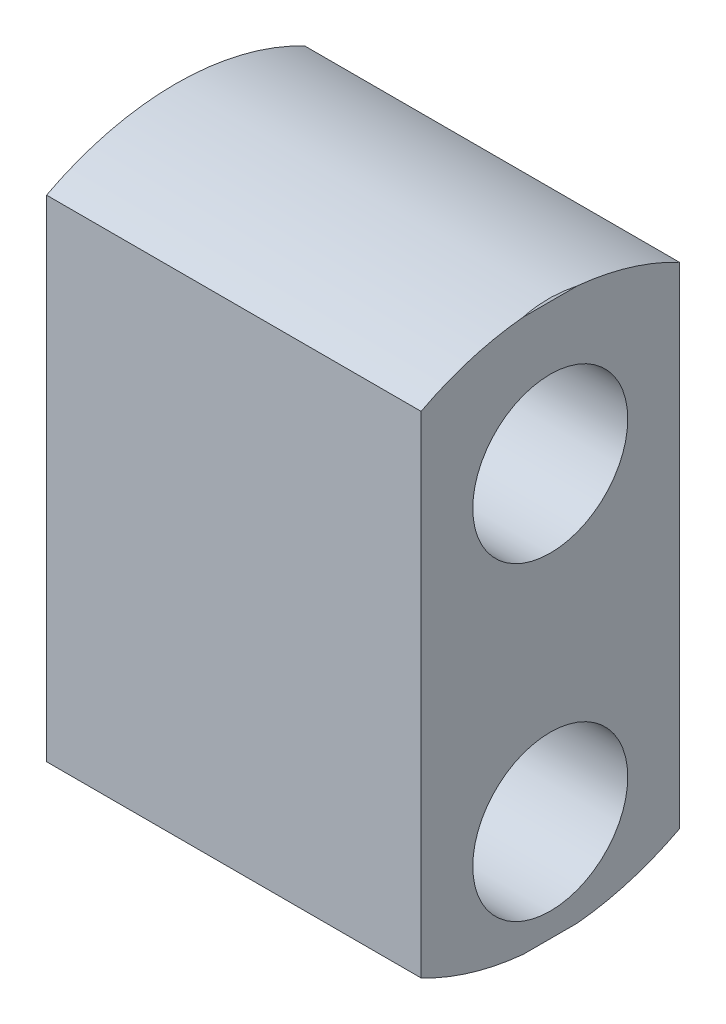
ISO-10303-21;
HEADER;
FILE_DESCRIPTION(('STEP AP214'),'2;1');
FILE_NAME('part.step','',(''),(''),'','','');
FILE_SCHEMA(('AUTOMOTIVE_DESIGN { 1 0 10303 214 1 1 1 1 }'));
ENDSEC;
DATA;
#1=APPLICATION_CONTEXT('core data for automotive mechanical design processes');
#2=APPLICATION_PROTOCOL_DEFINITION('international standard','automotive_design',2000,#1);
#3=PRODUCT_CONTEXT('',#1,'mechanical');
#4=PRODUCT('Part','Part','',(#3));
#5=PRODUCT_RELATED_PRODUCT_CATEGORY('part','',(#4));
#6=PRODUCT_DEFINITION_FORMATION('','',#4);
#7=PRODUCT_DEFINITION_CONTEXT('part definition',#1,'design');
#8=PRODUCT_DEFINITION('design','',#6,#7);
#9=PRODUCT_DEFINITION_SHAPE('','',#8);
#10=(LENGTH_UNIT() NAMED_UNIT(*) SI_UNIT(.MILLI.,.METRE.));
#11=(NAMED_UNIT(*) PLANE_ANGLE_UNIT() SI_UNIT($,.RADIAN.));
#12=(NAMED_UNIT(*) SI_UNIT($,.STERADIAN.) SOLID_ANGLE_UNIT());
#13=UNCERTAINTY_MEASURE_WITH_UNIT(LENGTH_MEASURE(1.E-05),#10,'distance_accuracy_value','');
#14=(GEOMETRIC_REPRESENTATION_CONTEXT(3) GLOBAL_UNCERTAINTY_ASSIGNED_CONTEXT((#13)) GLOBAL_UNIT_ASSIGNED_CONTEXT((#10,
#11,#12)) REPRESENTATION_CONTEXT('',''));
#15=CARTESIAN_POINT('',(0.,0.,0.));
#16=DIRECTION('',(0.,0.,1.));
#17=DIRECTION('',(1.,0.,0.));
#18=AXIS2_PLACEMENT_3D('',#15,#16,#17);
#19=CARTESIAN_POINT('',(0.,0.,5.));
#20=DIRECTION('',(0.,0.,1.));
#21=DIRECTION('',(1.,0.,0.));
#22=AXIS2_PLACEMENT_3D('',#19,#20,#21);
#23=PLANE('',#22);
#24=DIRECTION('',(0.,1.,0.));
#25=VECTOR('',#24,1.);
#26=CARTESIAN_POINT('',(-22.1518796505501,-14.001699548298,5.));
#27=LINE('',#26,#25);
#28=CARTESIAN_POINT('',(-22.1518796505501,-11.3508428851222,5.));
#29=VERTEX_POINT('',#28);
#30=CARTESIAN_POINT('',(-22.1518796505501,7.64737350525238,5.));
#31=VERTEX_POINT('',#30);
#32=EDGE_CURVE('E138',#29,#31,#27,.T.);
#33=ORIENTED_EDGE('',*,*,#32,.F.);
#34=DIRECTION('',(1.,0.,0.));
#35=VECTOR('',#34,1.);
#36=CARTESIAN_POINT('',(-22.1518796505501,-11.3508428851222,5.));
#37=LINE('',#36,#35);
#38=CARTESIAN_POINT('',(-7.65187965055005,-11.3508428851222,5.));
#39=VERTEX_POINT('',#38);
#40=EDGE_CURVE('E205',#29,#39,#37,.T.);
#41=ORIENTED_EDGE('',*,*,#40,.T.);
#42=DIRECTION('',(0.,1.,0.));
#43=VECTOR('',#42,1.);
#44=CARTESIAN_POINT('',(-7.65187965055005,-14.001699548298,5.));
#45=LINE('',#44,#43);
#46=CARTESIAN_POINT('',(-7.65187965055005,7.64737350525238,5.));
#47=VERTEX_POINT('',#46);
#48=EDGE_CURVE('E143',#39,#47,#45,.T.);
#49=ORIENTED_EDGE('',*,*,#48,.T.);
#50=DIRECTION('',(1.,0.,0.));
#51=VECTOR('',#50,1.);
#52=CARTESIAN_POINT('',(-22.1518796505501,7.64737350525238,5.));
#53=LINE('',#52,#51);
#54=EDGE_CURVE('E203',#47,#31,#53,.F.);
#55=ORIENTED_EDGE('',*,*,#54,.T.);
#56=EDGE_LOOP('',(#33,#41,#49,#55));
#57=FACE_BOUND('',#56,.T.);
#58=ADVANCED_FACE('F61',(#57),#23,.T.);
#59=CARTESIAN_POINT('',(0.,0.,-5.));
#60=DIRECTION('',(0.,0.,1.));
#61=DIRECTION('',(1.,0.,0.));
#62=AXIS2_PLACEMENT_3D('',#59,#60,#61);
#63=PLANE('',#62);
#64=CARTESIAN_POINT('',(-14.9018796505501,-4.00169954829801,-5.));
#65=DIRECTION('',(0.,0.,1.));
#66=DIRECTION('',(1.,0.,0.));
#67=AXIS2_PLACEMENT_3D('',#64,#65,#66);
#68=CIRCLE('',#67,4.);
#69=CARTESIAN_POINT('',(-10.9018796505501,-4.00169954829801,-5.));
#70=VERTEX_POINT('',#69);
#71=EDGE_CURVE('E148',#70,#70,#68,.T.);
#72=ORIENTED_EDGE('',*,*,#71,.T.);
#73=EDGE_LOOP('',(#72));
#74=FACE_BOUND('',#73,.T.);
#75=DIRECTION('',(1.,0.,0.));
#76=VECTOR('',#75,1.);
#77=CARTESIAN_POINT('',(-22.1518796505501,-11.3508428851222,-5.));
#78=LINE('',#77,#76);
#79=CARTESIAN_POINT('',(-22.1518796505501,-11.3508428851222,-5.));
#80=VERTEX_POINT('',#79);
#81=CARTESIAN_POINT('',(-7.65187965055005,-11.3508428851222,-5.));
#82=VERTEX_POINT('',#81);
#83=EDGE_CURVE('E128',#80,#82,#78,.T.);
#84=ORIENTED_EDGE('',*,*,#83,.F.);
#85=DIRECTION('',(0.,1.,0.));
#86=VECTOR('',#85,1.);
#87=CARTESIAN_POINT('',(-22.1518796505501,-14.001699548298,-5.));
#88=LINE('',#87,#86);
#89=CARTESIAN_POINT('',(-22.1518796505501,7.64737350525238,-5.));
#90=VERTEX_POINT('',#89);
#91=EDGE_CURVE('E136',#80,#90,#88,.T.);
#92=ORIENTED_EDGE('',*,*,#91,.T.);
#93=DIRECTION('',(1.,0.,0.));
#94=VECTOR('',#93,1.);
#95=CARTESIAN_POINT('',(-22.1518796505501,7.64737350525238,-5.));
#96=LINE('',#95,#94);
#97=CARTESIAN_POINT('',(-7.65187965055005,7.64737350525238,-5.));
#98=VERTEX_POINT('',#97);
#99=EDGE_CURVE('E117',#98,#90,#96,.F.);
#100=ORIENTED_EDGE('',*,*,#99,.F.);
#101=DIRECTION('',(0.,1.,0.));
#102=VECTOR('',#101,1.);
#103=CARTESIAN_POINT('',(-7.65187965055005,-14.001699548298,-5.));
#104=LINE('',#103,#102);
#105=EDGE_CURVE('E144',#82,#98,#104,.T.);
#106=ORIENTED_EDGE('',*,*,#105,.F.);
#107=EDGE_LOOP('',(#84,#92,#100,#106));
#108=FACE_BOUND('',#107,.T.);
#109=ADVANCED_FACE('F142',(#74,#108),#63,.F.);
#110=CARTESIAN_POINT('',(-7.65187965055005,-14.001699548298,5.));
#111=DIRECTION('',(-1.,0.,0.));
#112=DIRECTION('',(0.,0.,1.));
#113=AXIS2_PLACEMENT_3D('',#110,#111,#112);
#114=PLANE('',#113);
#115=CARTESIAN_POINT('',(-7.65187965055004,3.39277613170199,0.));
#116=DIRECTION('',(-1.,0.,0.));
#117=DIRECTION('',(0.,-1.,0.));
#118=AXIS2_PLACEMENT_3D('',#115,#116,#117);
#119=CIRCLE('',#118,3.);
#120=CARTESIAN_POINT('',(-7.65187965055004,0.392776131701986,0.));
#121=VERTEX_POINT('',#120);
#122=EDGE_CURVE('E218',#121,#121,#119,.T.);
#123=ORIENTED_EDGE('',*,*,#122,.T.);
#124=EDGE_LOOP('',(#123));
#125=FACE_BOUND('',#124,.T.);
#126=CARTESIAN_POINT('',(-7.65187965055004,-8.60893162829801,0.));
#127=DIRECTION('',(-1.,0.,0.));
#128=DIRECTION('',(0.,-1.,0.));
#129=AXIS2_PLACEMENT_3D('',#126,#127,#128);
#130=CIRCLE('',#129,3.);
#131=CARTESIAN_POINT('',(-7.65187965055004,-11.608931628298,0.));
#132=VERTEX_POINT('',#131);
#133=EDGE_CURVE('E162',#132,#132,#130,.T.);
#134=ORIENTED_EDGE('',*,*,#133,.T.);
#135=EDGE_LOOP('',(#134));
#136=FACE_BOUND('',#135,.T.);
#137=CARTESIAN_POINT('',(-7.65187965055005,-1.85173468993494,0.));
#138=DIRECTION('',(1.,0.,0.));
#139=DIRECTION('',(0.,0.,-1.));
#140=AXIS2_PLACEMENT_3D('',#137,#138,#139);
#141=CIRCLE('',#140,10.734666110498);
#142=CARTESIAN_POINT('',(-7.65187965055005,8.83120000125134,1.05259816061186));
#143=VERTEX_POINT('',#142);
#144=EDGE_CURVE('E82',#143,#47,#141,.T.);
#145=ORIENTED_EDGE('',*,*,#144,.T.);
#146=ORIENTED_EDGE('',*,*,#48,.F.);
#147=CARTESIAN_POINT('',(-7.65187965055005,-12.5346693811212,1.05259816061185));
#148=VERTEX_POINT('',#147);
#149=EDGE_CURVE('E269',#39,#148,#141,.T.);
#150=ORIENTED_EDGE('',*,*,#149,.T.);
#151=DIRECTION('',(0.,0.,-1.));
#152=VECTOR('',#151,1.);
#153=CARTESIAN_POINT('',(-7.65187965055005,-12.5346693811212,5.));
#154=LINE('',#153,#152);
#155=CARTESIAN_POINT('',(-7.65187965055005,-12.5346693811212,-1.05259816061186));
#156=VERTEX_POINT('',#155);
#157=EDGE_CURVE('E208',#156,#148,#154,.F.);
#158=ORIENTED_EDGE('',*,*,#157,.F.);
#159=EDGE_CURVE('E90',#156,#82,#141,.T.);
#160=ORIENTED_EDGE('',*,*,#159,.T.);
#161=ORIENTED_EDGE('',*,*,#105,.T.);
#162=CARTESIAN_POINT('',(-7.65187965055005,8.83120000125134,-1.05259816061186));
#163=VERTEX_POINT('',#162);
#164=EDGE_CURVE('E123',#98,#163,#141,.T.);
#165=ORIENTED_EDGE('',*,*,#164,.T.);
#166=DIRECTION('',(0.,0.,-1.));
#167=VECTOR('',#166,1.);
#168=CARTESIAN_POINT('',(-7.65187965055005,8.83120000125134,5.));
#169=LINE('',#168,#167);
#170=EDGE_CURVE('E211',#143,#163,#169,.T.);
#171=ORIENTED_EDGE('',*,*,#170,.F.);
#172=EDGE_LOOP('',(#145,#146,#150,#158,#160,#161,#165,#171));
#173=FACE_BOUND('',#172,.T.);
#174=ADVANCED_FACE('F63',(#125,#136,#173),#114,.F.);
#175=CARTESIAN_POINT('',(-22.1518796505501,-14.001699548298,5.));
#176=DIRECTION('',(-1.,0.,0.));
#177=DIRECTION('',(0.,-1.,0.));
#178=AXIS2_PLACEMENT_3D('',#175,#176,#177);
#179=PLANE('',#178);
#180=CARTESIAN_POINT('',(-22.1518796505501,3.39277613170198,0.));
#181=DIRECTION('',(-1.,0.,0.));
#182=DIRECTION('',(0.,-1.,0.));
#183=AXIS2_PLACEMENT_3D('',#180,#181,#182);
#184=CIRCLE('',#183,3.);
#185=CARTESIAN_POINT('',(-22.1518796505501,0.392776131701982,0.));
#186=VERTEX_POINT('',#185);
#187=EDGE_CURVE('E217',#186,#186,#184,.T.);
#188=ORIENTED_EDGE('',*,*,#187,.F.);
#189=EDGE_LOOP('',(#188));
#190=FACE_BOUND('',#189,.T.);
#191=CARTESIAN_POINT('',(-22.1518796505501,-8.60893162829801,0.));
#192=DIRECTION('',(-1.,0.,0.));
#193=DIRECTION('',(0.,-1.,0.));
#194=AXIS2_PLACEMENT_3D('',#191,#192,#193);
#195=CIRCLE('',#194,3.);
#196=CARTESIAN_POINT('',(-22.1518796505501,-11.608931628298,0.));
#197=VERTEX_POINT('',#196);
#198=EDGE_CURVE('E221',#197,#197,#195,.T.);
#199=ORIENTED_EDGE('',*,*,#198,.F.);
#200=EDGE_LOOP('',(#199));
#201=FACE_BOUND('',#200,.T.);
#202=ORIENTED_EDGE('',*,*,#32,.T.);
#203=CARTESIAN_POINT('',(-22.1518796505501,-1.85173468993494,0.));
#204=DIRECTION('',(1.,0.,0.));
#205=DIRECTION('',(0.,0.,-1.));
#206=AXIS2_PLACEMENT_3D('',#203,#204,#205);
#207=CIRCLE('',#206,10.734666110498);
#208=EDGE_CURVE('E120',#90,#31,#207,.T.);
#209=ORIENTED_EDGE('',*,*,#208,.F.);
#210=ORIENTED_EDGE('',*,*,#91,.F.);
#211=EDGE_CURVE('E139',#29,#80,#207,.T.);
#212=ORIENTED_EDGE('',*,*,#211,.F.);
#213=EDGE_LOOP('',(#202,#209,#210,#212));
#214=FACE_BOUND('',#213,.T.);
#215=ADVANCED_FACE('F134',(#190,#201,#214),#179,.T.);
#216=CARTESIAN_POINT('',(-15.1707717198946,-1.85173468993494,5.));
#217=DIRECTION('',(0.,0.,-1.));
#218=DIRECTION('',(-1.,0.,0.));
#219=AXIS2_PLACEMENT_3D('',#216,#217,#218);
#220=CYLINDRICAL_SURFACE('',#219,13.0636454164449);
#221=ORIENTED_EDGE('',*,*,#170,.T.);
#222=CARTESIAN_POINT('',(-7.65187965055005,8.83120000125134,-1.05259816061186));
#223=CARTESIAN_POINT('',(-7.67637752821421,8.84841187683,-0.878236899272604));
#224=CARTESIAN_POINT('',(-7.69493425842149,8.86137647549456,-0.7025871070402));
#225=CARTESIAN_POINT('',(-7.71966237630475,8.87860496264287,-0.351285343478452));
#226=CARTESIAN_POINT('',(-7.72592282534147,8.88293142056309,-0.175642671739214));
#227=CARTESIAN_POINT('',(-7.72592282534149,8.88293142056309,0.17564267173927));
#228=CARTESIAN_POINT('',(-7.71966237630478,8.87860496264287,0.351285343478517));
#229=CARTESIAN_POINT('',(-7.69493425842144,8.86137647549456,0.70258710704027));
#230=CARTESIAN_POINT('',(-7.67637752821406,8.84841187683,0.878236899272671));
#231=CARTESIAN_POINT('',(-7.65187965054969,8.83120000125135,1.05259816061191));
#232=B_SPLINE_CURVE_WITH_KNOTS('',3,(#222,#223,#224,#225,#226,#227,#228,#229,#230,#231),
.UNSPECIFIED.,.F.,.F.,(4,2,2,2,4),(0.,0.530639223236817,1.05742066876958,1.58420211430236,
2.11484133753919),.UNSPECIFIED.);
#233=EDGE_CURVE('E129',#163,#143,#232,.T.);
#234=ORIENTED_EDGE('',*,*,#233,.T.);
#235=EDGE_LOOP('',(#221,#234));
#236=FACE_BOUND('',#235,.T.);
#237=ADVANCED_FACE('F188',(#236),#220,.T.);
#238=ORIENTED_EDGE('',*,*,#157,.T.);
#239=CARTESIAN_POINT('',(-7.65187965055005,-12.5346693811212,1.05259816061185));
#240=CARTESIAN_POINT('',(-7.67637752821421,-12.5518812566999,0.878236899272588));
#241=CARTESIAN_POINT('',(-7.69493425842149,-12.5648458553644,0.702587107040187));
#242=CARTESIAN_POINT('',(-7.71966237630475,-12.5820743425127,0.351285343478445));
#243=CARTESIAN_POINT('',(-7.72592282534147,-12.586400800433,0.175642671739211));
#244=CARTESIAN_POINT('',(-7.72592282534149,-12.586400800433,-0.175642671739267));
#245=CARTESIAN_POINT('',(-7.71966237630478,-12.5820743425127,-0.35128534347851));
#246=CARTESIAN_POINT('',(-7.69493425842144,-12.5648458553644,-0.702587107040258));
#247=CARTESIAN_POINT('',(-7.67637752821407,-12.5518812566999,-0.878236899272655));
#248=CARTESIAN_POINT('',(-7.6518796505497,-12.5346693811212,-1.0525981606119));
#249=B_SPLINE_CURVE_WITH_KNOTS('',3,(#239,#240,#241,#242,#243,#244,#245,#246,#247,#248),
.UNSPECIFIED.,.F.,.F.,(4,2,2,2,4),(0.,0.530639223236807,1.05742066876956,1.58420211430233,
2.11484133753915),.UNSPECIFIED.);
#250=EDGE_CURVE('E13',#148,#156,#249,.T.);
#251=ORIENTED_EDGE('',*,*,#250,.T.);
#252=EDGE_LOOP('',(#238,#251));
#253=FACE_BOUND('',#252,.T.);
#254=ADVANCED_FACE('F191',(#253),#220,.T.);
#255=CARTESIAN_POINT('',(-14.9018796505501,-4.00169954829801,5.));
#256=DIRECTION('',(0.,0.,-1.));
#257=DIRECTION('',(-1.,0.,0.));
#258=AXIS2_PLACEMENT_3D('',#255,#256,#257);
#259=CYLINDRICAL_SURFACE('',#258,4.);
#260=ORIENTED_EDGE('',*,*,#71,.F.);
#261=EDGE_LOOP('',(#260));
#262=FACE_BOUND('',#261,.T.);
#263=CARTESIAN_POINT('',(-14.9018796505501,-8.00169954829801,2.93790217689747));
#264=CARTESIAN_POINT('',(-15.009680971212,-8.00170256781092,2.93789671743648));
#265=CARTESIAN_POINT('',(-15.1174486315377,-7.99734124209962,2.93700984025039));
#266=CARTESIAN_POINT('',(-15.332282009062,-7.97993526927935,2.93333465818504));
#267=CARTESIAN_POINT('',(-15.4393476269973,-7.96688941988753,2.93054609003495));
#268=CARTESIAN_POINT('',(-15.6521142106599,-7.93219344685846,2.92272806018889));
#269=CARTESIAN_POINT('',(-15.7578135114334,-7.91053369082764,2.91769608907048));
#270=CARTESIAN_POINT('',(-15.9669588269825,-7.85879799050505,2.90482538152114));
#271=CARTESIAN_POINT('',(-16.0704049419854,-7.82872242139683,2.89698677020809));
#272=CARTESIAN_POINT('',(-16.2747489162819,-7.76027579226539,2.87768193864195));
#273=CARTESIAN_POINT('',(-16.3756316948074,-7.72186455834107,2.8661980211918));
#274=CARTESIAN_POINT('',(-16.5734605314913,-7.63727248829404,2.8386364966831));
#275=CARTESIAN_POINT('',(-16.6704061666831,-7.59109082012143,2.82255839755556));
#276=CARTESIAN_POINT('',(-16.8592389264312,-7.49169915035806,2.78471028546148));
#277=CARTESIAN_POINT('',(-16.9511356482307,-7.43850318647467,2.76295155807114));
#278=CARTESIAN_POINT('',(-17.1290393239133,-7.32598080818305,2.71253291442309));
#279=CARTESIAN_POINT('',(-17.215048886495,-7.26665713868815,2.68387608059279));
#280=CARTESIAN_POINT('',(-17.4157412847546,-7.11652930842585,2.60436630595782));
#281=CARTESIAN_POINT('',(-17.5268847951609,-7.02314268521054,2.5492658452967));
#282=CARTESIAN_POINT('',(-17.7323810857431,-6.83153387913876,2.41953435559964));
#283=CARTESIAN_POINT('',(-17.8267488687989,-6.73331611827405,2.34492092652089));
#284=CARTESIAN_POINT('',(-17.9546163009476,-6.58724913505948,2.21743892015415));
#285=CARTESIAN_POINT('',(-17.9950493221483,-6.53863946985574,2.1722067035936));
#286=CARTESIAN_POINT('',(-18.0712285712394,-6.44279748265441,2.07663927848713));
#287=CARTESIAN_POINT('',(-18.10697662525,-6.39556462961459,2.02630607186742));
#288=CARTESIAN_POINT('',(-18.1738401704307,-6.30333510242198,1.92071415436311));
#289=CARTESIAN_POINT('',(-18.2049538191641,-6.25833932234235,1.8654534984234));
#290=CARTESIAN_POINT('',(-18.2626860209339,-6.17142353735232,1.75035824851849));
#291=CARTESIAN_POINT('',(-18.2893047552279,-6.12950340845481,1.69052383913139));
#292=CARTESIAN_POINT('',(-18.3365390757819,-6.05231325624153,1.57111108356259));
#293=CARTESIAN_POINT('',(-18.3574468123908,-6.01678235978814,1.51181659721875));
#294=CARTESIAN_POINT('',(-18.3958170453833,-5.94949276512536,1.39004868266576));
#295=CARTESIAN_POINT('',(-18.4132783506615,-5.91773537256338,1.32757416477099));
#296=CARTESIAN_POINT('',(-18.4608472970604,-5.82880172949509,1.1360557128877));
#297=CARTESIAN_POINT('',(-18.4861811265437,-5.77789363379996,1.00280907533354));
#298=CARTESIAN_POINT('',(-18.526399875771,-5.69435133085046,0.725740654940914));
#299=CARTESIAN_POINT('',(-18.5410204671694,-5.66218317689288,0.581742191618851));
#300=CARTESIAN_POINT('',(-18.5602697474315,-5.61933162437254,0.289903961710105));
#301=CARTESIAN_POINT('',(-18.5648963333352,-5.60865274766199,0.142063393281493));
#302=CARTESIAN_POINT('',(-18.564644912228,-5.60923226055088,-0.159140819206892));
#303=CARTESIAN_POINT('',(-18.5594031596428,-5.62133020097263,-0.312503215182147));
#304=CARTESIAN_POINT('',(-18.5380849086173,-5.66863559505376,-0.614875723977807));
#305=CARTESIAN_POINT('',(-18.5220074544655,-5.70384508715046,-0.763885451682174));
#306=CARTESIAN_POINT('',(-18.4773141899336,-5.79582095299882,-1.053315854851));
#307=CARTESIAN_POINT('',(-18.4486860862252,-5.85260845506874,-1.1937279548948));
#308=CARTESIAN_POINT('',(-18.3765530499302,-5.98469478254403,-1.46137541606051));
#309=CARTESIAN_POINT('',(-18.3330557427232,-6.05998411409623,-1.5886174876851));
#310=CARTESIAN_POINT('',(-18.2308939715834,-6.22124645162448,-1.82161510367655));
#311=CARTESIAN_POINT('',(-18.1728596968045,-6.30671272027255,-1.9279976223801));
#312=CARTESIAN_POINT('',(-18.0398209907047,-6.48476810967602,-2.12257500500665));
#313=CARTESIAN_POINT('',(-17.9648209043153,-6.57735540274264,-2.21077451455));
#314=CARTESIAN_POINT('',(-17.8001349460509,-6.76122363957894,-2.36646926403887));
#315=CARTESIAN_POINT('',(-17.7108398028002,-6.85248344567824,-2.43440615130473));
#316=CARTESIAN_POINT('',(-17.5178343196894,-7.03056693226742,-2.5534814864412));
#317=CARTESIAN_POINT('',(-17.4141180800086,-7.117388777158,-2.60461303012508));
#318=CARTESIAN_POINT('',(-17.1853336037448,-7.2892490431576,-2.69605446813942));
#319=CARTESIAN_POINT('',(-17.059206271523,-7.37353585925649,-2.7351074104965));
#320=CARTESIAN_POINT('',(-16.7955702440908,-7.52836014291613,-2.79989897674929));
#321=CARTESIAN_POINT('',(-16.658054591674,-7.59888911611821,-2.82562939117325));
#322=CARTESIAN_POINT('',(-16.4327381153113,-7.69830111418814,-2.85871451744375));
#323=CARTESIAN_POINT('',(-16.3476412881867,-7.73241057393771,-2.86927924615723));
#324=CARTESIAN_POINT('',(-16.1750394860819,-7.79478184956928,-2.88759769654569));
#325=CARTESIAN_POINT('',(-16.0875348966445,-7.82304459555299,-2.89535186547549));
#326=CARTESIAN_POINT('',(-15.9105681052247,-7.87352392163788,-2.90858320705104));
#327=CARTESIAN_POINT('',(-15.8211045208626,-7.89573607313026,-2.914058713415));
#328=CARTESIAN_POINT('',(-15.6407926827676,-7.93393791619768,-2.92314357523141));
#329=CARTESIAN_POINT('',(-15.5499447860541,-7.94992918485265,-2.92675340373538));
#330=CARTESIAN_POINT('',(-15.3539851000055,-7.97747175026114,-2.93282947929561));
#331=CARTESIAN_POINT('',(-15.248725614939,-7.98803519097404,-2.93505211786091));
#332=CARTESIAN_POINT('',(-15.0376725254679,-8.0007918685541,-2.9377215050738));
#333=CARTESIAN_POINT('',(-14.9318788712434,-8.00298430969315,-2.93816808489345));
#334=CARTESIAN_POINT('',(-14.7203864476874,-7.99898025685951,-2.93733958474523));
#335=CARTESIAN_POINT('',(-14.6146877856964,-7.99277827428577,-2.9360633783541));
#336=CARTESIAN_POINT('',(-14.4041543731407,-7.97202177187799,-2.93163059719315));
#337=CARTESIAN_POINT('',(-14.2993196153363,-7.95746732211292,-2.92847403819763));
#338=CARTESIAN_POINT('',(-14.0870715086722,-7.91937352773688,-2.91974445783367));
#339=CARTESIAN_POINT('',(-13.9797216836546,-7.8954995179528,-2.91408022785082));
#340=CARTESIAN_POINT('',(-13.7675253967852,-7.83905456907667,-2.89967878911494));
#341=CARTESIAN_POINT('',(-13.6626792120821,-7.80648267196085,-2.89094124181951));
#342=CARTESIAN_POINT('',(-13.4564543862391,-7.73301520621397,-2.86953527130995));
#343=CARTESIAN_POINT('',(-13.3550728012059,-7.6921269203846,-2.85687028236602));
#344=CARTESIAN_POINT('',(-13.1566168797544,-7.60251882012134,-2.82654720969687));
#345=CARTESIAN_POINT('',(-13.059541262973,-7.55380135385474,-2.80889062187552));
#346=CARTESIAN_POINT('',(-12.8926341911276,-7.46143964777074,-2.77220500648114));
#347=CARTESIAN_POINT('',(-12.8217146595811,-7.41924803723559,-2.75444879555444));
#348=CARTESIAN_POINT('',(-12.6834571783057,-7.33116119891118,-2.71470750677571));
#349=CARTESIAN_POINT('',(-12.6161184371111,-7.28526679524692,-2.69272336842807));
#350=CARTESIAN_POINT('',(-12.4855387782905,-7.19039898159534,-2.64397532890143));
#351=CARTESIAN_POINT('',(-12.4222946109618,-7.1414280756749,-2.61721528315047));
#352=CARTESIAN_POINT('',(-12.3003032970381,-7.04111326699932,-2.55838331797283));
#353=CARTESIAN_POINT('',(-12.2415562136401,-6.98976933091251,-2.52631132391794));
#354=CARTESIAN_POINT('',(-12.128535013477,-6.88519272757367,-2.4561591266616));
#355=CARTESIAN_POINT('',(-12.0742995314484,-6.83194841744838,-2.4180338355897));
#356=CARTESIAN_POINT('',(-11.9711602831235,-6.72500692932499,-2.33567558727321));
#357=CARTESIAN_POINT('',(-11.922256539916,-6.67130974936686,-2.29144260358143));
#358=CARTESIAN_POINT('',(-11.8300139146579,-6.56463010099413,-2.19679602515773));
#359=CARTESIAN_POINT('',(-11.7866729447925,-6.51164737115394,-2.14638476322029));
#360=CARTESIAN_POINT('',(-11.7055998986951,-6.40755671525802,-2.03948782684823));
#361=CARTESIAN_POINT('',(-11.6678671566039,-6.35644856717866,-1.98300287491137));
#362=CARTESIAN_POINT('',(-11.6023938398735,-6.26360076064418,-1.87189069400491));
#363=CARTESIAN_POINT('',(-11.573992450709,-6.2214996343242,-1.81795228814607));
#364=CARTESIAN_POINT('',(-11.5212110227573,-6.14025680303012,-1.70599813158619));
#365=CARTESIAN_POINT('',(-11.4968323374378,-6.10111609650005,-1.64798101789915));
#366=CARTESIAN_POINT('',(-11.4519001274539,-6.02643225461246,-1.52828946255565));
#367=CARTESIAN_POINT('',(-11.4313455259335,-5.9908881077594,-1.4666160569755));
#368=CARTESIAN_POINT('',(-11.3937963577036,-5.92389168359821,-1.34003778167696));
#369=CARTESIAN_POINT('',(-11.3768031577505,-5.89244097897575,-1.27513168313376));
#370=CARTESIAN_POINT('',(-11.3313761042125,-5.80606077277836,-1.0788897038214));
#371=CARTESIAN_POINT('',(-11.3076012943329,-5.75754373953914,-0.943546901253224));
#372=CARTESIAN_POINT('',(-11.2708567594739,-5.68024349698937,-0.666024848336979));
#373=CARTESIAN_POINT('',(-11.2578884804453,-5.65146292857676,-0.523844685817844));
#374=CARTESIAN_POINT('',(-11.241129273725,-5.6139528511755,-0.230082378356814));
#375=CARTESIAN_POINT('',(-11.2377557838466,-5.60613619973332,-0.0783585208082983));
#376=CARTESIAN_POINT('',(-11.2409927977351,-5.61350572939934,0.224443812335953));
#377=CARTESIAN_POINT('',(-11.247605467984,-5.6286969020213,0.375522140753779));
#378=CARTESIAN_POINT('',(-11.2717842473497,-5.68196087982656,0.675634736282255));
#379=CARTESIAN_POINT('',(-11.2895514955559,-5.72045338766389,0.824578936520633));
#380=CARTESIAN_POINT('',(-11.3380473190853,-5.81886435988126,1.11297645983188));
#381=CARTESIAN_POINT('',(-11.3687726122038,-5.87877739796879,1.25243217590711));
#382=CARTESIAN_POINT('',(-11.4447236669882,-6.01515220967478,1.51446905624154));
#383=CARTESIAN_POINT('',(-11.4896030790152,-6.09120580977913,1.63736231132472));
#384=CARTESIAN_POINT('',(-11.5960869476295,-6.25587205932742,1.8662714772892));
#385=CARTESIAN_POINT('',(-11.657682491807,-6.34447800433685,1.97229633411691));
#386=CARTESIAN_POINT('',(-11.7956675797336,-6.52434276053915,2.161207874894));
#387=CARTESIAN_POINT('',(-11.8713403161704,-6.61534049672239,2.24486986371576));
#388=CARTESIAN_POINT('',(-12.0385017585145,-6.79747074208781,2.39426574015678));
#389=CARTESIAN_POINT('',(-12.1299933562524,-6.88860327288628,2.45999634408348));
#390=CARTESIAN_POINT('',(-12.330049009136,-7.06834133929683,2.57651245830279));
#391=CARTESIAN_POINT('',(-12.4390352370546,-7.15679426518352,2.6268028543779));
#392=CARTESIAN_POINT('',(-12.6695950216806,-7.3239316972123,2.71249292856863));
#393=CARTESIAN_POINT('',(-12.7911762101737,-7.40261021640818,2.74788351175353));
#394=CARTESIAN_POINT('',(-13.0632999786592,-7.55806108178027,2.81136364841624));
#395=CARTESIAN_POINT('',(-13.215451832944,-7.63277941868324,2.83756329306982));
#396=CARTESIAN_POINT('',(-13.5292585239015,-7.76265725871874,2.87897074295332));
#397=CARTESIAN_POINT('',(-13.6909168311603,-7.8178095664177,2.8941745065636));
#398=CARTESIAN_POINT('',(-14.0256468066991,-7.90851929876859,2.91747995641441));
#399=CARTESIAN_POINT('',(-14.1989178840633,-7.94339905830696,2.92534084959383));
#400=CARTESIAN_POINT('',(-14.5487820103598,-7.98998985693751,2.93555717674183));
#401=CARTESIAN_POINT('',(-14.7253759482567,-8.00169460443272,2.93791111570334));
#402=CARTESIAN_POINT('',(-14.9018796505501,-8.00169954829801,2.93790217689747));
#403=B_SPLINE_CURVE_WITH_KNOTS('',3,(#263,#264,#265,#266,#267,#268,#269,#270,#271,#272,#273,
#274,#275,#276,#277,#278,#279,#280,#281,#282,#283,#284,#285,#286,#287,#288,#289,#290,#291,#292,
#293,#294,#295,#296,#297,#298,#299,#300,#301,#302,#303,#304,#305,#306,#307,#308,#309,#310,#311,
#312,#313,#314,#315,#316,#317,#318,#319,#320,#321,#322,#323,#324,#325,#326,#327,#328,#329,#330,
#331,#332,#333,#334,#335,#336,#337,#338,#339,#340,#341,#342,#343,#344,#345,#346,#347,#348,#349,
#350,#351,#352,#353,#354,#355,#356,#357,#358,#359,#360,#361,#362,#363,#364,#365,#366,#367,#368,
#369,#370,#371,#372,#373,#374,#375,#376,#377,#378,#379,#380,#381,#382,#383,#384,#385,#386,#387,
#388,#389,#390,#391,#392,#393,#394,#395,#396,#397,#398,#399,#400,#401,#402),.UNSPECIFIED.,.T.,
.F.,(4,2,2,2,2,2,2,2,2,2,2,2,2,2,2,2,2,2,2,2,2,2,2,2,2,2,2,2,2,2,2,2,2,2,2,2,2,2,2,2,2,2,2,2,2,
2,2,2,2,2,2,2,2,2,2,2,2,2,2,2,2,2,2,2,2,2,2,2,2,4),(0.,0.323253727983105,0.646552216424974,
0.970213250513069,1.29385985783605,1.61910237125956,1.94437973349841,2.26901572802549,
2.59350692697064,3.0572830088197,3.52064221636075,3.75359381726174,3.98645434582037,
4.21940720384919,4.45235066580581,4.66874341295688,4.88521081617203,5.31774509503328,
5.76062170862496,6.20359150419057,6.66320941064781,7.12286786082198,7.58297755470519,
8.04285164345693,8.48547414869697,8.92798342672424,9.35999192517645,9.79217768569062,
10.2603804387415,10.7288713605628,11.0054989799517,11.2820825592143,11.5588680375154,
11.8355833010663,12.152661020835,12.4697688805383,12.7870841778966,13.1043968133307,
13.4343434052872,13.7643263540208,14.0940215657752,14.423618077595,14.6766083236283,
14.9295424165248,15.1822732403503,15.4350076151228,15.6897213540944,15.9444361960483,
16.1990551573638,16.4536438638359,16.6756217473565,16.8976741653257,17.1196639587313,
17.3417387896247,17.7768076063945,18.2119346275228,18.6657227829974,19.1196094012515,
19.581925290631,20.0441241480883,20.4957916523815,20.9472188161319,21.3799849603025,
21.8128303018411,22.2583762908824,22.7041938508039,23.2168458773915,23.7296862374971,
24.2588077381682,24.7880728660793),.UNSPECIFIED.);
#404=CARTESIAN_POINT('',(-14.9018796505501,-8.00169954829801,2.93790217689747));
#405=VERTEX_POINT('',#404);
#406=EDGE_CURVE('E154',#405,#405,#403,.T.);
#407=ORIENTED_EDGE('',*,*,#406,.T.);
#408=EDGE_LOOP('',(#407));
#409=FACE_BOUND('',#408,.T.);
#410=CARTESIAN_POINT('',(-14.9018796505501,-4.00169954829801,4.9));
#411=DIRECTION('',(0.,0.,1.));
#412=DIRECTION('',(1.,0.,0.));
#413=AXIS2_PLACEMENT_3D('',#410,#411,#412);
#414=CIRCLE('',#413,4.);
#415=CARTESIAN_POINT('',(-10.9018796505501,-4.00169954829801,4.9));
#416=VERTEX_POINT('',#415);
#417=EDGE_CURVE('E163',#416,#416,#414,.F.);
#418=ORIENTED_EDGE('',*,*,#417,.F.);
#419=EDGE_LOOP('',(#418));
#420=FACE_BOUND('',#419,.T.);
#421=ADVANCED_FACE('F164',(#262,#409,#420),#259,.F.);
#422=CARTESIAN_POINT('',(-7.65187965055004,-8.60893162829801,0.));
#423=DIRECTION('',(-1.,0.,0.));
#424=DIRECTION('',(0.,-1.,0.));
#425=AXIS2_PLACEMENT_3D('',#422,#423,#424);
#426=CYLINDRICAL_SURFACE('',#425,3.);
#427=ORIENTED_EDGE('',*,*,#198,.T.);
#428=EDGE_LOOP('',(#427));
#429=FACE_BOUND('',#428,.T.);
#430=ORIENTED_EDGE('',*,*,#133,.F.);
#431=EDGE_LOOP('',(#430));
#432=FACE_BOUND('',#431,.T.);
#433=ORIENTED_EDGE('',*,*,#406,.F.);
#434=EDGE_LOOP('',(#433));
#435=FACE_BOUND('',#434,.T.);
#436=ADVANCED_FACE('F167',(#429,#432,#435),#426,.F.);
#437=CARTESIAN_POINT('',(-7.65187965055004,3.39277613170199,0.));
#438=DIRECTION('',(-1.,0.,0.));
#439=DIRECTION('',(0.,-1.,0.));
#440=AXIS2_PLACEMENT_3D('',#437,#438,#439);
#441=CYLINDRICAL_SURFACE('',#440,3.);
#442=ORIENTED_EDGE('',*,*,#122,.F.);
#443=EDGE_LOOP('',(#442));
#444=FACE_BOUND('',#443,.T.);
#445=ORIENTED_EDGE('',*,*,#187,.T.);
#446=EDGE_LOOP('',(#445));
#447=FACE_BOUND('',#446,.T.);
#448=ADVANCED_FACE('F171',(#444,#447),#441,.F.);
#449=CARTESIAN_POINT('',(-14.9018796505501,-4.00169954829801,4.9));
#450=DIRECTION('',(0.,0.,1.));
#451=DIRECTION('',(1.,0.,0.));
#452=AXIS2_PLACEMENT_3D('',#449,#450,#451);
#453=PLANE('',#452);
#454=CARTESIAN_POINT('',(-14.9018796505501,-3.65223208308398,4.9));
#455=DIRECTION('',(0.,0.,1.));
#456=DIRECTION('',(1.,0.,0.));
#457=AXIS2_PLACEMENT_3D('',#454,#455,#456);
#458=CIRCLE('',#457,0.399999999999999);
#459=CARTESIAN_POINT('',(-14.5018796505501,-3.65223208308398,4.9));
#460=VERTEX_POINT('',#459);
#461=EDGE_CURVE('E75',#460,#460,#458,.F.);
#462=ORIENTED_EDGE('',*,*,#461,.F.);
#463=EDGE_LOOP('',(#462));
#464=FACE_BOUND('',#463,.T.);
#465=ORIENTED_EDGE('',*,*,#417,.T.);
#466=EDGE_LOOP('',(#465));
#467=FACE_BOUND('',#466,.T.);
#468=ADVANCED_FACE('F175',(#464,#467),#453,.F.);
#469=CARTESIAN_POINT('',(-14.9018796505501,-3.65223208308398,-6.13137084989847));
#470=DIRECTION('',(0.,0.,1.));
#471=DIRECTION('',(1.,0.,0.));
#472=AXIS2_PLACEMENT_3D('',#469,#470,#471);
#473=CYLINDRICAL_SURFACE('',#472,0.399999999999999);
#474=CARTESIAN_POINT('',(-14.9018796505501,-3.65223208308398,-5.));
#475=DIRECTION('',(0.,0.,1.));
#476=DIRECTION('',(1.,0.,0.));
#477=AXIS2_PLACEMENT_3D('',#474,#475,#476);
#478=CIRCLE('',#477,0.399999999999999);
#479=CARTESIAN_POINT('',(-14.5018796505501,-3.65223208308398,-5.));
#480=VERTEX_POINT('',#479);
#481=EDGE_CURVE('E214',#480,#480,#478,.T.);
#482=ORIENTED_EDGE('',*,*,#481,.T.);
#483=EDGE_LOOP('',(#482));
#484=FACE_BOUND('',#483,.T.);
#485=ORIENTED_EDGE('',*,*,#461,.T.);
#486=EDGE_LOOP('',(#485));
#487=FACE_BOUND('',#486,.T.);
#488=ADVANCED_FACE('F179',(#484,#487),#473,.T.);
#489=CARTESIAN_POINT('',(0.,0.,-5.));
#490=DIRECTION('',(0.,0.,1.));
#491=DIRECTION('',(1.,0.,0.));
#492=AXIS2_PLACEMENT_3D('',#489,#490,#491);
#493=PLANE('',#492);
#494=ORIENTED_EDGE('',*,*,#481,.F.);
#495=EDGE_LOOP('',(#494));
#496=FACE_BOUND('',#495,.T.);
#497=ADVANCED_FACE('F183',(#496),#493,.F.);
#498=CARTESIAN_POINT('',(-22.1518796505501,-1.85173468993494,0.));
#499=DIRECTION('',(1.,0.,0.));
#500=DIRECTION('',(0.,0.,-1.));
#501=AXIS2_PLACEMENT_3D('',#498,#499,#500);
#502=CYLINDRICAL_SURFACE('',#501,10.734666110498);
#503=ORIENTED_EDGE('',*,*,#211,.T.);
#504=ORIENTED_EDGE('',*,*,#83,.T.);
#505=ORIENTED_EDGE('',*,*,#159,.F.);
#506=ORIENTED_EDGE('',*,*,#250,.F.);
#507=ORIENTED_EDGE('',*,*,#149,.F.);
#508=ORIENTED_EDGE('',*,*,#40,.F.);
#509=EDGE_LOOP('',(#503,#504,#505,#506,#507,#508));
#510=FACE_BOUND('',#509,.T.);
#511=ADVANCED_FACE('F186',(#510),#502,.T.);
#512=ORIENTED_EDGE('',*,*,#144,.F.);
#513=ORIENTED_EDGE('',*,*,#233,.F.);
#514=ORIENTED_EDGE('',*,*,#164,.F.);
#515=ORIENTED_EDGE('',*,*,#99,.T.);
#516=ORIENTED_EDGE('',*,*,#208,.T.);
#517=ORIENTED_EDGE('',*,*,#54,.F.);
#518=EDGE_LOOP('',(#512,#513,#514,#515,#516,#517));
#519=FACE_BOUND('',#518,.T.);
#520=ADVANCED_FACE('F119',(#519),#502,.T.);
#521=CLOSED_SHELL('',(#58,#109,#174,#215,#237,#254,#421,#436,#448,#468,#488,#497,#511,#520));
#522=MANIFOLD_SOLID_BREP('B2',#521);
#523=ADVANCED_BREP_SHAPE_REPRESENTATION('',(#18,#522),#14);
#524=SHAPE_DEFINITION_REPRESENTATION(#9,#523);
ENDSEC;
END-ISO-10303-21;
